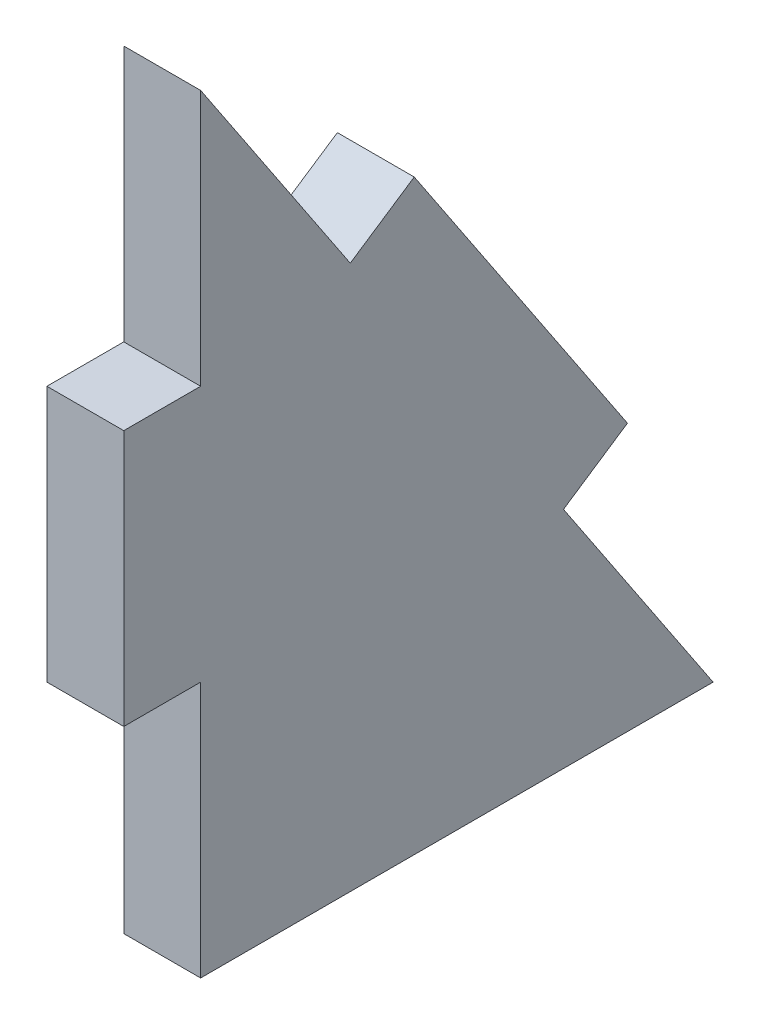
ISO-10303-21;
HEADER;
FILE_DESCRIPTION(('STEP AP214'),'2;1');
FILE_NAME('part.step','',(''),(''),'','','');
FILE_SCHEMA(('AUTOMOTIVE_DESIGN { 1 0 10303 214 1 1 1 1 }'));
ENDSEC;
DATA;
#1=APPLICATION_CONTEXT('core data for automotive mechanical design processes');
#2=APPLICATION_PROTOCOL_DEFINITION('international standard','automotive_design',2000,#1);
#3=PRODUCT_CONTEXT('',#1,'mechanical');
#4=PRODUCT('Part','Part','',(#3));
#5=PRODUCT_RELATED_PRODUCT_CATEGORY('part','',(#4));
#6=PRODUCT_DEFINITION_FORMATION('','',#4);
#7=PRODUCT_DEFINITION_CONTEXT('part definition',#1,'design');
#8=PRODUCT_DEFINITION('design','',#6,#7);
#9=PRODUCT_DEFINITION_SHAPE('','',#8);
#10=(LENGTH_UNIT() NAMED_UNIT(*) SI_UNIT(.MILLI.,.METRE.));
#11=(NAMED_UNIT(*) PLANE_ANGLE_UNIT() SI_UNIT($,.RADIAN.));
#12=(NAMED_UNIT(*) SI_UNIT($,.STERADIAN.) SOLID_ANGLE_UNIT());
#13=UNCERTAINTY_MEASURE_WITH_UNIT(LENGTH_MEASURE(1.E-05),#10,'distance_accuracy_value','');
#14=(GEOMETRIC_REPRESENTATION_CONTEXT(3) GLOBAL_UNCERTAINTY_ASSIGNED_CONTEXT((#13)) GLOBAL_UNIT_ASSIGNED_CONTEXT((#10,
#11,#12)) REPRESENTATION_CONTEXT('',''));
#15=CARTESIAN_POINT('',(0.,0.,0.));
#16=DIRECTION('',(0.,0.,1.));
#17=DIRECTION('',(1.,0.,0.));
#18=AXIS2_PLACEMENT_3D('',#15,#16,#17);
#19=CARTESIAN_POINT('',(3.,0.,0.));
#20=DIRECTION('',(0.,0.,-1.));
#21=DIRECTION('',(0.,1.,0.));
#22=AXIS2_PLACEMENT_3D('',#19,#20,#21);
#23=PLANE('',#22);
#24=DIRECTION('',(0.,-1.,0.));
#25=VECTOR('',#24,1.);
#26=CARTESIAN_POINT('',(0.,0.,0.));
#27=LINE('',#26,#25);
#28=CARTESIAN_POINT('',(0.,10.,0.));
#29=VERTEX_POINT('',#28);
#30=CARTESIAN_POINT('',(0.,0.,0.));
#31=VERTEX_POINT('',#30);
#32=EDGE_CURVE('E147',#29,#31,#27,.T.);
#33=ORIENTED_EDGE('',*,*,#32,.T.);
#34=DIRECTION('',(-1.,0.,0.));
#35=VECTOR('',#34,1.);
#36=CARTESIAN_POINT('',(3.,0.,0.));
#37=LINE('',#36,#35);
#38=CARTESIAN_POINT('',(3.,0.,0.));
#39=VERTEX_POINT('',#38);
#40=EDGE_CURVE('E11',#39,#31,#37,.T.);
#41=ORIENTED_EDGE('',*,*,#40,.F.);
#42=DIRECTION('',(0.,-1.,0.));
#43=VECTOR('',#42,1.);
#44=CARTESIAN_POINT('',(3.,0.,0.));
#45=LINE('',#44,#43);
#46=CARTESIAN_POINT('',(3.,10.,0.));
#47=VERTEX_POINT('',#46);
#48=EDGE_CURVE('E167',#47,#39,#45,.T.);
#49=ORIENTED_EDGE('',*,*,#48,.F.);
#50=DIRECTION('',(-1.,0.,0.));
#51=VECTOR('',#50,1.);
#52=CARTESIAN_POINT('',(3.,10.,0.));
#53=LINE('',#52,#51);
#54=EDGE_CURVE('E143',#47,#29,#53,.T.);
#55=ORIENTED_EDGE('',*,*,#54,.T.);
#56=EDGE_LOOP('',(#33,#41,#49,#55));
#57=FACE_BOUND('',#56,.T.);
#58=ADVANCED_FACE('F33',(#57),#23,.F.);
#59=CARTESIAN_POINT('',(3.,0.,0.));
#60=DIRECTION('',(0.,1.,0.));
#61=DIRECTION('',(0.,0.,1.));
#62=AXIS2_PLACEMENT_3D('',#59,#60,#61);
#63=PLANE('',#62);
#64=DIRECTION('',(0.,0.,-1.));
#65=VECTOR('',#64,1.);
#66=CARTESIAN_POINT('',(0.,0.,0.));
#67=LINE('',#66,#65);
#68=CARTESIAN_POINT('',(0.,0.,-20.));
#69=VERTEX_POINT('',#68);
#70=EDGE_CURVE('E150',#31,#69,#67,.T.);
#71=ORIENTED_EDGE('',*,*,#70,.T.);
#72=DIRECTION('',(-1.,0.,0.));
#73=VECTOR('',#72,1.);
#74=CARTESIAN_POINT('',(3.,0.,-20.));
#75=LINE('',#74,#73);
#76=CARTESIAN_POINT('',(3.,0.,-20.));
#77=VERTEX_POINT('',#76);
#78=EDGE_CURVE('E41',#77,#69,#75,.T.);
#79=ORIENTED_EDGE('',*,*,#78,.F.);
#80=DIRECTION('',(0.,0.,-1.));
#81=VECTOR('',#80,1.);
#82=CARTESIAN_POINT('',(3.,0.,0.));
#83=LINE('',#82,#81);
#84=EDGE_CURVE('E101',#39,#77,#83,.T.);
#85=ORIENTED_EDGE('',*,*,#84,.F.);
#86=ORIENTED_EDGE('',*,*,#40,.T.);
#87=EDGE_LOOP('',(#71,#79,#85,#86));
#88=FACE_BOUND('',#87,.T.);
#89=ADVANCED_FACE('F239',(#88),#63,.F.);
#90=CARTESIAN_POINT('',(3.,8.75962279246617,-14.1602514716892));
#91=DIRECTION('',(0.,-0.554700196225229,0.832050294337844));
#92=DIRECTION('',(0.,-0.832050294337844,-0.554700196225229));
#93=AXIS2_PLACEMENT_3D('',#90,#91,#92);
#94=PLANE('',#93);
#95=DIRECTION('',(0.,0.832050294337844,0.554700196225229));
#96=VECTOR('',#95,1.);
#97=CARTESIAN_POINT('',(0.,8.75962279246617,-14.1602514716892));
#98=LINE('',#97,#96);
#99=CARTESIAN_POINT('',(0.,8.75962279246617,-14.1602514716892));
#100=VERTEX_POINT('',#99);
#101=EDGE_CURVE('E152',#69,#100,#98,.T.);
#102=ORIENTED_EDGE('',*,*,#101,.T.);
#103=DIRECTION('',(-1.,0.,0.));
#104=VECTOR('',#103,1.);
#105=CARTESIAN_POINT('',(3.,8.75962279246617,-14.1602514716892));
#106=LINE('',#105,#104);
#107=CARTESIAN_POINT('',(3.,8.75962279246617,-14.1602514716892));
#108=VERTEX_POINT('',#107);
#109=EDGE_CURVE('E183',#108,#100,#106,.T.);
#110=ORIENTED_EDGE('',*,*,#109,.F.);
#111=DIRECTION('',(0.,0.832050294337844,0.554700196225229));
#112=VECTOR('',#111,1.);
#113=CARTESIAN_POINT('',(3.,8.75962279246617,-14.1602514716892));
#114=LINE('',#113,#112);
#115=EDGE_CURVE('E191',#77,#108,#114,.T.);
#116=ORIENTED_EDGE('',*,*,#115,.F.);
#117=ORIENTED_EDGE('',*,*,#78,.T.);
#118=EDGE_LOOP('',(#102,#110,#116,#117));
#119=FACE_BOUND('',#118,.T.);
#120=ADVANCED_FACE('F189',(#119),#94,.F.);
#121=CARTESIAN_POINT('',(3.,8.75962279246617,-14.1602514716892));
#122=DIRECTION('',(0.,0.832050294337841,0.554700196225233));
#123=DIRECTION('',(0.,-0.554700196225233,0.832050294337841));
#124=AXIS2_PLACEMENT_3D('',#121,#122,#123);
#125=PLANE('',#124);
#126=DIRECTION('',(0.,0.554700196225233,-0.832050294337841));
#127=VECTOR('',#126,1.);
#128=CARTESIAN_POINT('',(0.,8.75962279246617,-14.1602514716892));
#129=LINE('',#128,#127);
#130=CARTESIAN_POINT('',(0.,10.4237233811419,-16.6564023547027));
#131=VERTEX_POINT('',#130);
#132=EDGE_CURVE('E154',#100,#131,#129,.T.);
#133=ORIENTED_EDGE('',*,*,#132,.T.);
#134=DIRECTION('',(-1.,0.,0.));
#135=VECTOR('',#134,1.);
#136=CARTESIAN_POINT('',(3.,10.4237233811419,-16.6564023547027));
#137=LINE('',#136,#135);
#138=CARTESIAN_POINT('',(3.,10.4237233811419,-16.6564023547027));
#139=VERTEX_POINT('',#138);
#140=EDGE_CURVE('E180',#139,#131,#137,.T.);
#141=ORIENTED_EDGE('',*,*,#140,.F.);
#142=DIRECTION('',(0.,0.554700196225233,-0.832050294337841));
#143=VECTOR('',#142,1.);
#144=CARTESIAN_POINT('',(3.,8.75962279246617,-14.1602514716892));
#145=LINE('',#144,#143);
#146=EDGE_CURVE('E209',#108,#139,#145,.T.);
#147=ORIENTED_EDGE('',*,*,#146,.F.);
#148=ORIENTED_EDGE('',*,*,#109,.T.);
#149=EDGE_LOOP('',(#133,#141,#147,#148));
#150=FACE_BOUND('',#149,.T.);
#151=ADVANCED_FACE('F200',(#150),#125,.F.);
#152=CARTESIAN_POINT('',(3.,22.9044777962095,-8.33589941132431));
#153=DIRECTION('',(0.,-0.554700196225229,0.832050294337844));
#154=DIRECTION('',(0.,-0.832050294337843,-0.554700196225229));
#155=AXIS2_PLACEMENT_3D('',#152,#153,#154);
#156=PLANE('',#155);
#157=DIRECTION('',(0.,0.832050294337844,0.554700196225229));
#158=VECTOR('',#157,1.);
#159=CARTESIAN_POINT('',(0.,22.9044777962095,-8.33589941132431));
#160=LINE('',#159,#158);
#161=CARTESIAN_POINT('',(0.,22.9044777962095,-8.33589941132431));
#162=VERTEX_POINT('',#161);
#163=EDGE_CURVE('E156',#131,#162,#160,.T.);
#164=ORIENTED_EDGE('',*,*,#163,.T.);
#165=DIRECTION('',(-1.,0.,0.));
#166=VECTOR('',#165,1.);
#167=CARTESIAN_POINT('',(3.,22.9044777962095,-8.33589941132431));
#168=LINE('',#167,#166);
#169=CARTESIAN_POINT('',(3.,22.9044777962095,-8.33589941132431));
#170=VERTEX_POINT('',#169);
#171=EDGE_CURVE('E177',#170,#162,#168,.T.);
#172=ORIENTED_EDGE('',*,*,#171,.F.);
#173=DIRECTION('',(0.,0.832050294337844,0.554700196225229));
#174=VECTOR('',#173,1.);
#175=CARTESIAN_POINT('',(3.,22.9044777962095,-8.33589941132431));
#176=LINE('',#175,#174);
#177=EDGE_CURVE('E206',#139,#170,#176,.T.);
#178=ORIENTED_EDGE('',*,*,#177,.F.);
#179=ORIENTED_EDGE('',*,*,#140,.T.);
#180=EDGE_LOOP('',(#164,#172,#178,#179));
#181=FACE_BOUND('',#180,.T.);
#182=ADVANCED_FACE('F204',(#181),#156,.F.);
#183=CARTESIAN_POINT('',(3.,21.2403772075338,-5.83974852831078));
#184=DIRECTION('',(0.,-0.832050294337842,-0.554700196225231));
#185=DIRECTION('',(0.,0.554700196225231,-0.832050294337842));
#186=AXIS2_PLACEMENT_3D('',#183,#184,#185);
#187=PLANE('',#186);
#188=DIRECTION('',(0.,-0.554700196225231,0.832050294337842));
#189=VECTOR('',#188,1.);
#190=CARTESIAN_POINT('',(0.,21.2403772075338,-5.83974852831078));
#191=LINE('',#190,#189);
#192=CARTESIAN_POINT('',(0.,21.2403772075338,-5.83974852831078));
#193=VERTEX_POINT('',#192);
#194=EDGE_CURVE('E158',#162,#193,#191,.T.);
#195=ORIENTED_EDGE('',*,*,#194,.T.);
#196=DIRECTION('',(-1.,0.,0.));
#197=VECTOR('',#196,1.);
#198=CARTESIAN_POINT('',(3.,21.2403772075338,-5.83974852831078));
#199=LINE('',#198,#197);
#200=CARTESIAN_POINT('',(3.,21.2403772075338,-5.83974852831078));
#201=VERTEX_POINT('',#200);
#202=EDGE_CURVE('E174',#201,#193,#199,.T.);
#203=ORIENTED_EDGE('',*,*,#202,.F.);
#204=DIRECTION('',(0.,-0.554700196225231,0.832050294337842));
#205=VECTOR('',#204,1.);
#206=CARTESIAN_POINT('',(3.,21.2403772075338,-5.83974852831078));
#207=LINE('',#206,#205);
#208=EDGE_CURVE('E208',#170,#201,#207,.T.);
#209=ORIENTED_EDGE('',*,*,#208,.F.);
#210=ORIENTED_EDGE('',*,*,#171,.T.);
#211=EDGE_LOOP('',(#195,#203,#209,#210));
#212=FACE_BOUND('',#211,.T.);
#213=ADVANCED_FACE('F252',(#212),#187,.F.);
#214=CARTESIAN_POINT('',(3.,30.,0.));
#215=DIRECTION('',(0.,-0.554700196225229,0.832050294337844));
#216=DIRECTION('',(0.,-0.832050294337844,-0.554700196225229));
#217=AXIS2_PLACEMENT_3D('',#214,#215,#216);
#218=PLANE('',#217);
#219=DIRECTION('',(0.,0.832050294337844,0.554700196225229));
#220=VECTOR('',#219,1.);
#221=CARTESIAN_POINT('',(0.,30.,0.));
#222=LINE('',#221,#220);
#223=CARTESIAN_POINT('',(0.,30.,0.));
#224=VERTEX_POINT('',#223);
#225=EDGE_CURVE('E160',#193,#224,#222,.T.);
#226=ORIENTED_EDGE('',*,*,#225,.T.);
#227=DIRECTION('',(-1.,0.,0.));
#228=VECTOR('',#227,1.);
#229=CARTESIAN_POINT('',(3.,30.,0.));
#230=LINE('',#229,#228);
#231=CARTESIAN_POINT('',(3.,30.,0.));
#232=VERTEX_POINT('',#231);
#233=EDGE_CURVE('E171',#232,#224,#230,.T.);
#234=ORIENTED_EDGE('',*,*,#233,.F.);
#235=DIRECTION('',(0.,0.832050294337844,0.554700196225229));
#236=VECTOR('',#235,1.);
#237=CARTESIAN_POINT('',(3.,30.,0.));
#238=LINE('',#237,#236);
#239=EDGE_CURVE('E211',#201,#232,#238,.T.);
#240=ORIENTED_EDGE('',*,*,#239,.F.);
#241=ORIENTED_EDGE('',*,*,#202,.T.);
#242=EDGE_LOOP('',(#226,#234,#240,#241));
#243=FACE_BOUND('',#242,.T.);
#244=ADVANCED_FACE('F220',(#243),#218,.F.);
#245=CARTESIAN_POINT('',(3.,20.,0.));
#246=DIRECTION('',(0.,0.,-1.));
#247=DIRECTION('',(0.,1.,0.));
#248=AXIS2_PLACEMENT_3D('',#245,#246,#247);
#249=PLANE('',#248);
#250=DIRECTION('',(0.,-1.,0.));
#251=VECTOR('',#250,1.);
#252=CARTESIAN_POINT('',(0.,20.,0.));
#253=LINE('',#252,#251);
#254=CARTESIAN_POINT('',(0.,20.,0.));
#255=VERTEX_POINT('',#254);
#256=EDGE_CURVE('E162',#224,#255,#253,.T.);
#257=ORIENTED_EDGE('',*,*,#256,.T.);
#258=DIRECTION('',(-1.,0.,0.));
#259=VECTOR('',#258,1.);
#260=CARTESIAN_POINT('',(3.,20.,0.));
#261=LINE('',#260,#259);
#262=CARTESIAN_POINT('',(3.,20.,0.));
#263=VERTEX_POINT('',#262);
#264=EDGE_CURVE('E138',#263,#255,#261,.T.);
#265=ORIENTED_EDGE('',*,*,#264,.F.);
#266=DIRECTION('',(0.,-1.,0.));
#267=VECTOR('',#266,1.);
#268=CARTESIAN_POINT('',(3.,20.,0.));
#269=LINE('',#268,#267);
#270=EDGE_CURVE('E129',#232,#263,#269,.T.);
#271=ORIENTED_EDGE('',*,*,#270,.F.);
#272=ORIENTED_EDGE('',*,*,#233,.T.);
#273=EDGE_LOOP('',(#257,#265,#271,#272));
#274=FACE_BOUND('',#273,.T.);
#275=ADVANCED_FACE('F224',(#274),#249,.F.);
#276=CARTESIAN_POINT('',(3.,20.,0.));
#277=DIRECTION('',(0.,-1.,0.));
#278=DIRECTION('',(0.,0.,-1.));
#279=AXIS2_PLACEMENT_3D('',#276,#277,#278);
#280=PLANE('',#279);
#281=DIRECTION('',(0.,0.,1.));
#282=VECTOR('',#281,1.);
#283=CARTESIAN_POINT('',(0.,20.,0.));
#284=LINE('',#283,#282);
#285=CARTESIAN_POINT('',(0.,20.,3.));
#286=VERTEX_POINT('',#285);
#287=EDGE_CURVE('E137',#255,#286,#284,.T.);
#288=ORIENTED_EDGE('',*,*,#287,.T.);
#289=DIRECTION('',(-1.,0.,0.));
#290=VECTOR('',#289,1.);
#291=CARTESIAN_POINT('',(3.,20.,3.));
#292=LINE('',#291,#290);
#293=CARTESIAN_POINT('',(3.,20.,3.));
#294=VERTEX_POINT('',#293);
#295=EDGE_CURVE('E134',#294,#286,#292,.T.);
#296=ORIENTED_EDGE('',*,*,#295,.F.);
#297=DIRECTION('',(0.,0.,1.));
#298=VECTOR('',#297,1.);
#299=CARTESIAN_POINT('',(3.,20.,0.));
#300=LINE('',#299,#298);
#301=EDGE_CURVE('E123',#263,#294,#300,.T.);
#302=ORIENTED_EDGE('',*,*,#301,.F.);
#303=ORIENTED_EDGE('',*,*,#264,.T.);
#304=EDGE_LOOP('',(#288,#296,#302,#303));
#305=FACE_BOUND('',#304,.T.);
#306=ADVANCED_FACE('F135',(#305),#280,.F.);
#307=CARTESIAN_POINT('',(3.,20.,3.));
#308=DIRECTION('',(0.,0.,-1.));
#309=DIRECTION('',(0.,1.,0.));
#310=AXIS2_PLACEMENT_3D('',#307,#308,#309);
#311=PLANE('',#310);
#312=DIRECTION('',(0.,-1.,0.));
#313=VECTOR('',#312,1.);
#314=CARTESIAN_POINT('',(0.,20.,3.));
#315=LINE('',#314,#313);
#316=CARTESIAN_POINT('',(0.,10.,3.));
#317=VERTEX_POINT('',#316);
#318=EDGE_CURVE('E87',#286,#317,#315,.T.);
#319=ORIENTED_EDGE('',*,*,#318,.T.);
#320=DIRECTION('',(-1.,0.,0.));
#321=VECTOR('',#320,1.);
#322=CARTESIAN_POINT('',(3.,10.,3.));
#323=LINE('',#322,#321);
#324=CARTESIAN_POINT('',(3.,10.,3.));
#325=VERTEX_POINT('',#324);
#326=EDGE_CURVE('E139',#325,#317,#323,.T.);
#327=ORIENTED_EDGE('',*,*,#326,.F.);
#328=DIRECTION('',(0.,-1.,0.));
#329=VECTOR('',#328,1.);
#330=CARTESIAN_POINT('',(3.,20.,3.));
#331=LINE('',#330,#329);
#332=EDGE_CURVE('E127',#294,#325,#331,.T.);
#333=ORIENTED_EDGE('',*,*,#332,.F.);
#334=ORIENTED_EDGE('',*,*,#295,.T.);
#335=EDGE_LOOP('',(#319,#327,#333,#334));
#336=FACE_BOUND('',#335,.T.);
#337=ADVANCED_FACE('F141',(#336),#311,.F.);
#338=CARTESIAN_POINT('',(3.,10.,0.));
#339=DIRECTION('',(0.,1.,0.));
#340=DIRECTION('',(0.,0.,1.));
#341=AXIS2_PLACEMENT_3D('',#338,#339,#340);
#342=PLANE('',#341);
#343=DIRECTION('',(0.,0.,-1.));
#344=VECTOR('',#343,1.);
#345=CARTESIAN_POINT('',(0.,10.,0.));
#346=LINE('',#345,#344);
#347=EDGE_CURVE('E93',#317,#29,#346,.T.);
#348=ORIENTED_EDGE('',*,*,#347,.T.);
#349=ORIENTED_EDGE('',*,*,#54,.F.);
#350=DIRECTION('',(0.,0.,-1.));
#351=VECTOR('',#350,1.);
#352=CARTESIAN_POINT('',(3.,10.,0.));
#353=LINE('',#352,#351);
#354=EDGE_CURVE('E49',#325,#47,#353,.T.);
#355=ORIENTED_EDGE('',*,*,#354,.F.);
#356=ORIENTED_EDGE('',*,*,#326,.T.);
#357=EDGE_LOOP('',(#348,#349,#355,#356));
#358=FACE_BOUND('',#357,.T.);
#359=ADVANCED_FACE('F228',(#358),#342,.F.);
#360=CARTESIAN_POINT('',(3.,0.,0.));
#361=DIRECTION('',(1.,0.,0.));
#362=DIRECTION('',(0.,0.,-1.));
#363=AXIS2_PLACEMENT_3D('',#360,#361,#362);
#364=PLANE('',#363);
#365=ORIENTED_EDGE('',*,*,#48,.T.);
#366=ORIENTED_EDGE('',*,*,#84,.T.);
#367=ORIENTED_EDGE('',*,*,#115,.T.);
#368=ORIENTED_EDGE('',*,*,#146,.T.);
#369=ORIENTED_EDGE('',*,*,#177,.T.);
#370=ORIENTED_EDGE('',*,*,#208,.T.);
#371=ORIENTED_EDGE('',*,*,#239,.T.);
#372=ORIENTED_EDGE('',*,*,#270,.T.);
#373=ORIENTED_EDGE('',*,*,#301,.T.);
#374=ORIENTED_EDGE('',*,*,#332,.T.);
#375=ORIENTED_EDGE('',*,*,#354,.T.);
#376=EDGE_LOOP('',(#365,#366,#367,#368,#369,#370,#371,#372,#373,#374,#375));
#377=FACE_BOUND('',#376,.T.);
#378=ADVANCED_FACE('F125',(#377),#364,.T.);
#379=CARTESIAN_POINT('',(0.,0.,0.));
#380=DIRECTION('',(1.,0.,0.));
#381=DIRECTION('',(0.,0.,-1.));
#382=AXIS2_PLACEMENT_3D('',#379,#380,#381);
#383=PLANE('',#382);
#384=ORIENTED_EDGE('',*,*,#32,.F.);
#385=ORIENTED_EDGE('',*,*,#347,.F.);
#386=ORIENTED_EDGE('',*,*,#318,.F.);
#387=ORIENTED_EDGE('',*,*,#287,.F.);
#388=ORIENTED_EDGE('',*,*,#256,.F.);
#389=ORIENTED_EDGE('',*,*,#225,.F.);
#390=ORIENTED_EDGE('',*,*,#194,.F.);
#391=ORIENTED_EDGE('',*,*,#163,.F.);
#392=ORIENTED_EDGE('',*,*,#132,.F.);
#393=ORIENTED_EDGE('',*,*,#101,.F.);
#394=ORIENTED_EDGE('',*,*,#70,.F.);
#395=EDGE_LOOP('',(#384,#385,#386,#387,#388,#389,#390,#391,#392,#393,#394));
#396=FACE_BOUND('',#395,.T.);
#397=ADVANCED_FACE('F195',(#396),#383,.F.);
#398=CLOSED_SHELL('',(#58,#89,#120,#151,#182,#213,#244,#275,#306,#337,#359,#378,#397));
#399=MANIFOLD_SOLID_BREP('B2',#398);
#400=ADVANCED_BREP_SHAPE_REPRESENTATION('',(#18,#399),#14);
#401=SHAPE_DEFINITION_REPRESENTATION(#9,#400);
ENDSEC;
END-ISO-10303-21;
